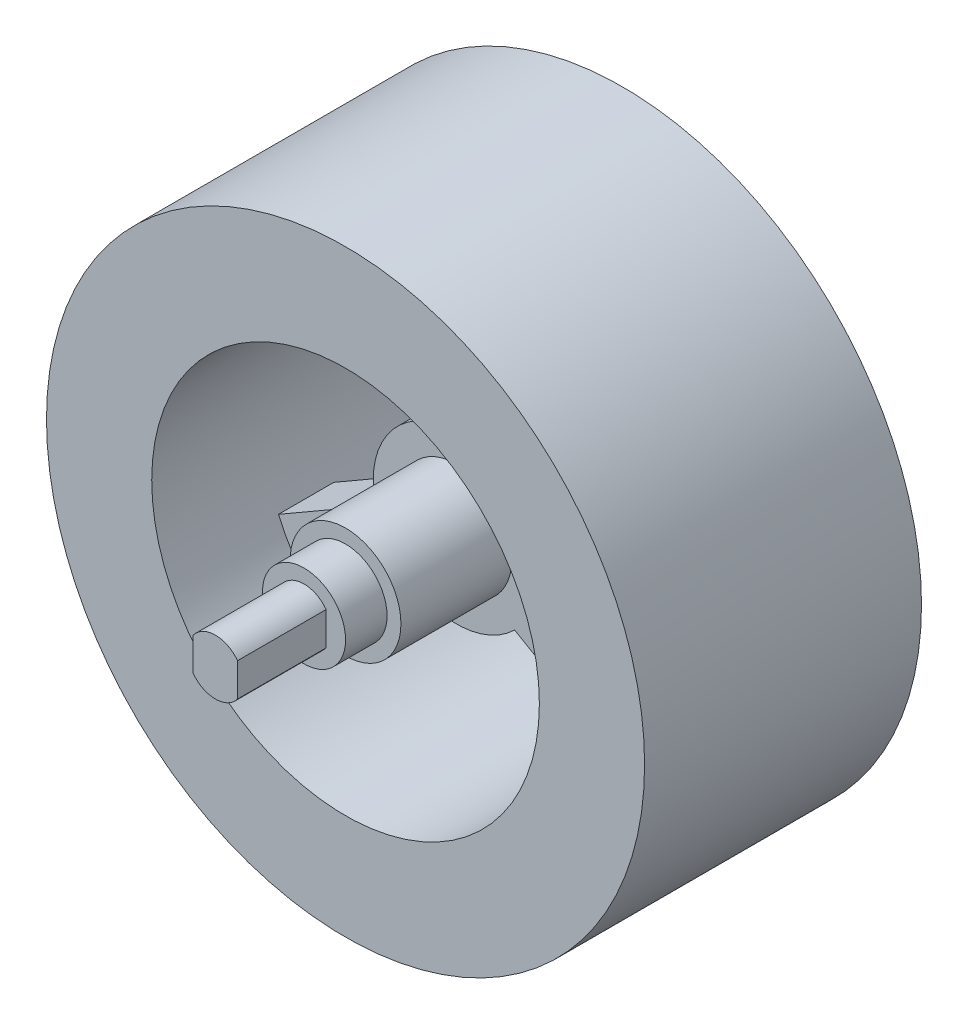
ISO-10303-21;
HEADER;
FILE_DESCRIPTION(('STEP AP214'),'2;1');
FILE_NAME('part.step','',(''),(''),'','','');
FILE_SCHEMA(('AUTOMOTIVE_DESIGN { 1 0 10303 214 1 1 1 1 }'));
ENDSEC;
DATA;
#1=APPLICATION_CONTEXT('core data for automotive mechanical design processes');
#2=APPLICATION_PROTOCOL_DEFINITION('international standard','automotive_design',2000,#1);
#3=PRODUCT_CONTEXT('',#1,'mechanical');
#4=PRODUCT('Part','Part','',(#3));
#5=PRODUCT_RELATED_PRODUCT_CATEGORY('part','',(#4));
#6=PRODUCT_DEFINITION_FORMATION('','',#4);
#7=PRODUCT_DEFINITION_CONTEXT('part definition',#1,'design');
#8=PRODUCT_DEFINITION('design','',#6,#7);
#9=PRODUCT_DEFINITION_SHAPE('','',#8);
#10=(LENGTH_UNIT() NAMED_UNIT(*) SI_UNIT(.MILLI.,.METRE.));
#11=(NAMED_UNIT(*) PLANE_ANGLE_UNIT() SI_UNIT($,.RADIAN.));
#12=(NAMED_UNIT(*) SI_UNIT($,.STERADIAN.) SOLID_ANGLE_UNIT());
#13=UNCERTAINTY_MEASURE_WITH_UNIT(LENGTH_MEASURE(1.E-05),#10,'distance_accuracy_value','');
#14=(GEOMETRIC_REPRESENTATION_CONTEXT(3) GLOBAL_UNCERTAINTY_ASSIGNED_CONTEXT((#13)) GLOBAL_UNIT_ASSIGNED_CONTEXT((#10,
#11,#12)) REPRESENTATION_CONTEXT('',''));
#15=CARTESIAN_POINT('',(0.,0.,0.));
#16=DIRECTION('',(0.,0.,1.));
#17=DIRECTION('',(1.,0.,0.));
#18=AXIS2_PLACEMENT_3D('',#15,#16,#17);
#19=CARTESIAN_POINT('',(0.,0.,48.5));
#20=DIRECTION('',(0.,0.,1.));
#21=DIRECTION('',(1.,0.,0.));
#22=AXIS2_PLACEMENT_3D('',#19,#20,#21);
#23=PLANE('',#22);
#24=CARTESIAN_POINT('',(0.,0.,48.5));
#25=DIRECTION('',(0.,0.,1.));
#26=DIRECTION('',(1.,0.,0.));
#27=AXIS2_PLACEMENT_3D('',#24,#25,#26);
#28=CIRCLE('',#27,5.);
#29=CARTESIAN_POINT('',(4.,3.,48.5));
#30=VERTEX_POINT('',#29);
#31=CARTESIAN_POINT('',(-4.,3.,48.5));
#32=VERTEX_POINT('',#31);
#33=EDGE_CURVE('E255',#30,#32,#28,.T.);
#34=ORIENTED_EDGE('',*,*,#33,.T.);
#35=DIRECTION('',(0.,-1.,0.));
#36=VECTOR('',#35,1.);
#37=CARTESIAN_POINT('',(-4.,3.,48.5));
#38=LINE('',#37,#36);
#39=CARTESIAN_POINT('',(-4.,-3.,48.5));
#40=VERTEX_POINT('',#39);
#41=EDGE_CURVE('E236',#32,#40,#38,.T.);
#42=ORIENTED_EDGE('',*,*,#41,.T.);
#43=CARTESIAN_POINT('',(4.,-3.,48.5));
#44=VERTEX_POINT('',#43);
#45=EDGE_CURVE('E260',#40,#44,#28,.T.);
#46=ORIENTED_EDGE('',*,*,#45,.T.);
#47=DIRECTION('',(0.,1.,0.));
#48=VECTOR('',#47,1.);
#49=CARTESIAN_POINT('',(4.,3.,48.5));
#50=LINE('',#49,#48);
#51=EDGE_CURVE('E360',#44,#30,#50,.T.);
#52=ORIENTED_EDGE('',*,*,#51,.T.);
#53=EDGE_LOOP('',(#34,#42,#46,#52));
#54=FACE_BOUND('',#53,.T.);
#55=ADVANCED_FACE('F89',(#54),#23,.T.);
#56=CARTESIAN_POINT('',(0.,0.,48.5));
#57=DIRECTION('',(0.,0.,-1.));
#58=DIRECTION('',(-1.,0.,0.));
#59=AXIS2_PLACEMENT_3D('',#56,#57,#58);
#60=CYLINDRICAL_SURFACE('',#59,5.);
#61=DIRECTION('',(0.,0.,1.));
#62=VECTOR('',#61,1.);
#63=CARTESIAN_POINT('',(-4.,-3.,32.5));
#64=LINE('',#63,#62);
#65=CARTESIAN_POINT('',(-4.,-3.,32.5));
#66=VERTEX_POINT('',#65);
#67=EDGE_CURVE('E242',#66,#40,#64,.T.);
#68=ORIENTED_EDGE('',*,*,#67,.F.);
#69=CARTESIAN_POINT('',(0.,0.,32.5));
#70=DIRECTION('',(0.,0.,1.));
#71=DIRECTION('',(1.,0.,0.));
#72=AXIS2_PLACEMENT_3D('',#69,#70,#71);
#73=CIRCLE('',#72,5.);
#74=CARTESIAN_POINT('',(4.,-3.,32.5));
#75=VERTEX_POINT('',#74);
#76=EDGE_CURVE('E248',#75,#66,#73,.F.);
#77=ORIENTED_EDGE('',*,*,#76,.F.);
#78=DIRECTION('',(0.,0.,1.));
#79=VECTOR('',#78,1.);
#80=CARTESIAN_POINT('',(4.,-3.,32.5));
#81=LINE('',#80,#79);
#82=EDGE_CURVE('E362',#75,#44,#81,.T.);
#83=ORIENTED_EDGE('',*,*,#82,.T.);
#84=ORIENTED_EDGE('',*,*,#45,.F.);
#85=EDGE_LOOP('',(#68,#77,#83,#84));
#86=FACE_BOUND('',#85,.T.);
#87=ADVANCED_FACE('F306',(#86),#60,.T.);
#88=DIRECTION('',(0.,0.,1.));
#89=VECTOR('',#88,1.);
#90=CARTESIAN_POINT('',(-4.,3.,32.5));
#91=LINE('',#90,#89);
#92=CARTESIAN_POINT('',(-4.,3.,32.5));
#93=VERTEX_POINT('',#92);
#94=EDGE_CURVE('E230',#93,#32,#91,.T.);
#95=ORIENTED_EDGE('',*,*,#94,.T.);
#96=ORIENTED_EDGE('',*,*,#33,.F.);
#97=DIRECTION('',(0.,0.,1.));
#98=VECTOR('',#97,1.);
#99=CARTESIAN_POINT('',(4.,3.,32.5));
#100=LINE('',#99,#98);
#101=CARTESIAN_POINT('',(4.,3.,32.5));
#102=VERTEX_POINT('',#101);
#103=EDGE_CURVE('E253',#102,#30,#100,.T.);
#104=ORIENTED_EDGE('',*,*,#103,.F.);
#105=EDGE_CURVE('E246',#93,#102,#73,.F.);
#106=ORIENTED_EDGE('',*,*,#105,.F.);
#107=EDGE_LOOP('',(#95,#96,#104,#106));
#108=FACE_BOUND('',#107,.T.);
#109=ADVANCED_FACE('F252',(#108),#60,.T.);
#110=CARTESIAN_POINT('',(0.,0.,-48.5));
#111=DIRECTION('',(0.,0.,1.));
#112=DIRECTION('',(1.,0.,0.));
#113=AXIS2_PLACEMENT_3D('',#110,#111,#112);
#114=CIRCLE('',#113,5.);
#115=CARTESIAN_POINT('',(4.,3.,-48.5));
#116=VERTEX_POINT('',#115);
#117=CARTESIAN_POINT('',(-4.,3.,-48.5));
#118=VERTEX_POINT('',#117);
#119=EDGE_CURVE('E342',#116,#118,#114,.T.);
#120=ORIENTED_EDGE('',*,*,#119,.T.);
#121=DIRECTION('',(0.,0.,-1.));
#122=VECTOR('',#121,1.);
#123=CARTESIAN_POINT('',(-4.,3.,-32.5));
#124=LINE('',#123,#122);
#125=CARTESIAN_POINT('',(-4.,3.,-32.5));
#126=VERTEX_POINT('',#125);
#127=EDGE_CURVE('E378',#126,#118,#124,.T.);
#128=ORIENTED_EDGE('',*,*,#127,.F.);
#129=CARTESIAN_POINT('',(0.,0.,-32.5));
#130=DIRECTION('',(0.,0.,1.));
#131=DIRECTION('',(1.,0.,0.));
#132=AXIS2_PLACEMENT_3D('',#129,#130,#131);
#133=CIRCLE('',#132,5.);
#134=CARTESIAN_POINT('',(4.,3.,-32.5));
#135=VERTEX_POINT('',#134);
#136=EDGE_CURVE('E269',#126,#135,#133,.F.);
#137=ORIENTED_EDGE('',*,*,#136,.T.);
#138=DIRECTION('',(0.,0.,-1.));
#139=VECTOR('',#138,1.);
#140=CARTESIAN_POINT('',(4.,3.,-32.5));
#141=LINE('',#140,#139);
#142=EDGE_CURVE('E388',#135,#116,#141,.T.);
#143=ORIENTED_EDGE('',*,*,#142,.T.);
#144=EDGE_LOOP('',(#120,#128,#137,#143));
#145=FACE_BOUND('',#144,.T.);
#146=ADVANCED_FACE('F699',(#145),#60,.T.);
#147=CARTESIAN_POINT('',(4.,-3.,-32.5));
#148=VERTEX_POINT('',#147);
#149=CARTESIAN_POINT('',(-4.,-3.,-32.5));
#150=VERTEX_POINT('',#149);
#151=EDGE_CURVE('E276',#148,#150,#133,.F.);
#152=ORIENTED_EDGE('',*,*,#151,.T.);
#153=DIRECTION('',(0.,0.,-1.));
#154=VECTOR('',#153,1.);
#155=CARTESIAN_POINT('',(-4.,-3.,-32.5));
#156=LINE('',#155,#154);
#157=CARTESIAN_POINT('',(-4.,-3.,-48.5));
#158=VERTEX_POINT('',#157);
#159=EDGE_CURVE('E374',#150,#158,#156,.T.);
#160=ORIENTED_EDGE('',*,*,#159,.T.);
#161=CARTESIAN_POINT('',(4.,-3.,-48.5));
#162=VERTEX_POINT('',#161);
#163=EDGE_CURVE('E264',#158,#162,#114,.T.);
#164=ORIENTED_EDGE('',*,*,#163,.T.);
#165=DIRECTION('',(0.,0.,-1.));
#166=VECTOR('',#165,1.);
#167=CARTESIAN_POINT('',(4.,-3.,-32.5));
#168=LINE('',#167,#166);
#169=EDGE_CURVE('E377',#148,#162,#168,.T.);
#170=ORIENTED_EDGE('',*,*,#169,.F.);
#171=EDGE_LOOP('',(#152,#160,#164,#170));
#172=FACE_BOUND('',#171,.T.);
#173=ADVANCED_FACE('F314',(#172),#60,.T.);
#174=CARTESIAN_POINT('',(0.,0.,-5.));
#175=DIRECTION('',(0.,0.,1.));
#176=DIRECTION('',(1.,0.,0.));
#177=AXIS2_PLACEMENT_3D('',#174,#175,#176);
#178=PLANE('',#177);
#179=CARTESIAN_POINT('',(0.,0.,-5.));
#180=DIRECTION('',(0.,0.,1.));
#181=DIRECTION('',(1.,0.,0.));
#182=AXIS2_PLACEMENT_3D('',#179,#180,#181);
#183=CIRCLE('',#182,10.);
#184=CARTESIAN_POINT('',(10.,0.,-5.));
#185=VERTEX_POINT('',#184);
#186=EDGE_CURVE('E12',#185,#185,#183,.F.);
#187=ORIENTED_EDGE('',*,*,#186,.F.);
#188=EDGE_LOOP('',(#187));
#189=FACE_BOUND('',#188,.T.);
#190=DIRECTION('',(0.866025403784439,-0.5,0.));
#191=VECTOR('',#190,1.);
#192=CARTESIAN_POINT('',(2.,3.46410161513775,-5.));
#193=LINE('',#192,#191);
#194=CARTESIAN_POINT('',(14.5199840255489,-3.76431453226272,-5.));
#195=VERTEX_POINT('',#194);
#196=CARTESIAN_POINT('',(32.1122898498271,-13.921237035576,-5.));
#197=VERTEX_POINT('',#196);
#198=EDGE_CURVE('E498',#195,#197,#193,.T.);
#199=ORIENTED_EDGE('',*,*,#198,.T.);
#200=CARTESIAN_POINT('',(0.,0.,-5.));
#201=DIRECTION('',(0.,0.,1.));
#202=DIRECTION('',(1.,0.,0.));
#203=AXIS2_PLACEMENT_3D('',#200,#201,#202);
#204=CIRCLE('',#203,35.);
#205=CARTESIAN_POINT('',(28.1122898498271,-20.8494402658515,-5.));
#206=VERTEX_POINT('',#205);
#207=EDGE_CURVE('E421',#197,#206,#204,.F.);
#208=ORIENTED_EDGE('',*,*,#207,.T.);
#209=DIRECTION('',(0.866025403784439,-0.5,0.));
#210=VECTOR('',#209,1.);
#211=CARTESIAN_POINT('',(-2.,-3.46410161513776,-5.));
#212=LINE('',#211,#210);
#213=CARTESIAN_POINT('',(10.5199840255489,-10.6925177625382,-5.));
#214=VERTEX_POINT('',#213);
#215=EDGE_CURVE('E494',#214,#206,#212,.T.);
#216=ORIENTED_EDGE('',*,*,#215,.F.);
#217=CARTESIAN_POINT('',(0.,0.,-5.));
#218=DIRECTION('',(0.,0.,1.));
#219=DIRECTION('',(1.,0.,0.));
#220=AXIS2_PLACEMENT_3D('',#217,#218,#219);
#221=CIRCLE('',#220,15.);
#222=CARTESIAN_POINT('',(-10.5199840255489,-10.6925177625382,-5.));
#223=VERTEX_POINT('',#222);
#224=EDGE_CURVE('E486',#223,#214,#221,.T.);
#225=ORIENTED_EDGE('',*,*,#224,.F.);
#226=DIRECTION('',(-0.866025403784438,-0.500000000000001,0.));
#227=VECTOR('',#226,1.);
#228=CARTESIAN_POINT('',(2.,-3.46410161513775,-5.));
#229=LINE('',#228,#227);
#230=CARTESIAN_POINT('',(-28.1122898498271,-20.8494402658515,-5.));
#231=VERTEX_POINT('',#230);
#232=EDGE_CURVE('E490',#223,#231,#229,.T.);
#233=ORIENTED_EDGE('',*,*,#232,.T.);
#234=CARTESIAN_POINT('',(-32.1122898498271,-13.921237035576,-5.));
#235=VERTEX_POINT('',#234);
#236=EDGE_CURVE('E429',#231,#235,#204,.F.);
#237=ORIENTED_EDGE('',*,*,#236,.T.);
#238=DIRECTION('',(-0.866025403784438,-0.5,0.));
#239=VECTOR('',#238,1.);
#240=CARTESIAN_POINT('',(-2.,3.46410161513776,-5.));
#241=LINE('',#240,#239);
#242=CARTESIAN_POINT('',(-14.5199840255489,-3.76431453226273,-5.));
#243=VERTEX_POINT('',#242);
#244=EDGE_CURVE('E484',#243,#235,#241,.T.);
#245=ORIENTED_EDGE('',*,*,#244,.F.);
#246=CARTESIAN_POINT('',(-4.,14.456832294801,-5.));
#247=VERTEX_POINT('',#246);
#248=EDGE_CURVE('E481',#247,#243,#221,.T.);
#249=ORIENTED_EDGE('',*,*,#248,.F.);
#250=DIRECTION('',(0.,1.,0.));
#251=VECTOR('',#250,1.);
#252=CARTESIAN_POINT('',(-4.,0.,-5.));
#253=LINE('',#252,#251);
#254=CARTESIAN_POINT('',(-4.,34.7706773014274,-5.));
#255=VERTEX_POINT('',#254);
#256=EDGE_CURVE('E427',#247,#255,#253,.T.);
#257=ORIENTED_EDGE('',*,*,#256,.T.);
#258=CARTESIAN_POINT('',(4.,34.7706773014274,-5.));
#259=VERTEX_POINT('',#258);
#260=EDGE_CURVE('E424',#255,#259,#204,.F.);
#261=ORIENTED_EDGE('',*,*,#260,.T.);
#262=DIRECTION('',(0.,1.,0.));
#263=VECTOR('',#262,1.);
#264=CARTESIAN_POINT('',(4.,0.,-5.));
#265=LINE('',#264,#263);
#266=CARTESIAN_POINT('',(4.,14.456832294801,-5.));
#267=VERTEX_POINT('',#266);
#268=EDGE_CURVE('E454',#267,#259,#265,.T.);
#269=ORIENTED_EDGE('',*,*,#268,.F.);
#270=EDGE_CURVE('E485',#195,#267,#221,.T.);
#271=ORIENTED_EDGE('',*,*,#270,.F.);
#272=EDGE_LOOP('',(#199,#208,#216,#225,#233,#237,#245,#249,#257,#261,#269,#271));
#273=FACE_BOUND('',#272,.T.);
#274=ADVANCED_FACE('F524',(#189,#273),#178,.F.);
#275=CARTESIAN_POINT('',(0.,0.,5.));
#276=DIRECTION('',(0.,0.,1.));
#277=DIRECTION('',(1.,0.,0.));
#278=AXIS2_PLACEMENT_3D('',#275,#276,#277);
#279=PLANE('',#278);
#280=CARTESIAN_POINT('',(0.,0.,5.));
#281=DIRECTION('',(0.,0.,1.));
#282=DIRECTION('',(1.,0.,0.));
#283=AXIS2_PLACEMENT_3D('',#280,#281,#282);
#284=CIRCLE('',#283,10.);
#285=CARTESIAN_POINT('',(10.,0.,5.));
#286=VERTEX_POINT('',#285);
#287=EDGE_CURVE('E93',#286,#286,#284,.F.);
#288=ORIENTED_EDGE('',*,*,#287,.T.);
#289=EDGE_LOOP('',(#288));
#290=FACE_BOUND('',#289,.T.);
#291=CARTESIAN_POINT('',(0.,0.,5.));
#292=DIRECTION('',(0.,0.,1.));
#293=DIRECTION('',(1.,0.,0.));
#294=AXIS2_PLACEMENT_3D('',#291,#292,#293);
#295=CIRCLE('',#294,35.);
#296=CARTESIAN_POINT('',(32.1122898498271,-13.921237035576,5.));
#297=VERTEX_POINT('',#296);
#298=CARTESIAN_POINT('',(28.1122898498271,-20.8494402658515,5.));
#299=VERTEX_POINT('',#298);
#300=EDGE_CURVE('E415',#297,#299,#295,.F.);
#301=ORIENTED_EDGE('',*,*,#300,.F.);
#302=DIRECTION('',(0.866025403784439,-0.5,0.));
#303=VECTOR('',#302,1.);
#304=CARTESIAN_POINT('',(2.,3.46410161513775,5.));
#305=LINE('',#304,#303);
#306=CARTESIAN_POINT('',(14.5199840255489,-3.76431453226272,5.));
#307=VERTEX_POINT('',#306);
#308=EDGE_CURVE('E470',#307,#297,#305,.T.);
#309=ORIENTED_EDGE('',*,*,#308,.F.);
#310=CARTESIAN_POINT('',(0.,0.,5.));
#311=DIRECTION('',(0.,0.,1.));
#312=DIRECTION('',(1.,0.,0.));
#313=AXIS2_PLACEMENT_3D('',#310,#311,#312);
#314=CIRCLE('',#313,15.);
#315=CARTESIAN_POINT('',(4.,14.456832294801,5.));
#316=VERTEX_POINT('',#315);
#317=EDGE_CURVE('E458',#307,#316,#314,.T.);
#318=ORIENTED_EDGE('',*,*,#317,.T.);
#319=DIRECTION('',(0.,1.,0.));
#320=VECTOR('',#319,1.);
#321=CARTESIAN_POINT('',(4.,0.,5.));
#322=LINE('',#321,#320);
#323=CARTESIAN_POINT('',(4.,34.7706773014274,5.));
#324=VERTEX_POINT('',#323);
#325=EDGE_CURVE('E473',#316,#324,#322,.T.);
#326=ORIENTED_EDGE('',*,*,#325,.T.);
#327=CARTESIAN_POINT('',(-4.,34.7706773014274,5.));
#328=VERTEX_POINT('',#327);
#329=EDGE_CURVE('E422',#328,#324,#295,.F.);
#330=ORIENTED_EDGE('',*,*,#329,.F.);
#331=DIRECTION('',(0.,1.,0.));
#332=VECTOR('',#331,1.);
#333=CARTESIAN_POINT('',(-4.,0.,5.));
#334=LINE('',#333,#332);
#335=CARTESIAN_POINT('',(-4.,14.456832294801,5.));
#336=VERTEX_POINT('',#335);
#337=EDGE_CURVE('E449',#336,#328,#334,.T.);
#338=ORIENTED_EDGE('',*,*,#337,.F.);
#339=CARTESIAN_POINT('',(-14.5199840255489,-3.76431453226273,5.));
#340=VERTEX_POINT('',#339);
#341=EDGE_CURVE('E453',#336,#340,#314,.T.);
#342=ORIENTED_EDGE('',*,*,#341,.T.);
#343=DIRECTION('',(-0.866025403784438,-0.5,0.));
#344=VECTOR('',#343,1.);
#345=CARTESIAN_POINT('',(-2.,3.46410161513776,5.));
#346=LINE('',#345,#344);
#347=CARTESIAN_POINT('',(-32.1122898498271,-13.921237035576,5.));
#348=VERTEX_POINT('',#347);
#349=EDGE_CURVE('E457',#340,#348,#346,.T.);
#350=ORIENTED_EDGE('',*,*,#349,.T.);
#351=CARTESIAN_POINT('',(-28.1122898498271,-20.8494402658515,5.));
#352=VERTEX_POINT('',#351);
#353=EDGE_CURVE('E423',#352,#348,#295,.F.);
#354=ORIENTED_EDGE('',*,*,#353,.F.);
#355=DIRECTION('',(-0.866025403784438,-0.500000000000001,0.));
#356=VECTOR('',#355,1.);
#357=CARTESIAN_POINT('',(2.,-3.46410161513775,5.));
#358=LINE('',#357,#356);
#359=CARTESIAN_POINT('',(-10.5199840255489,-10.6925177625382,5.));
#360=VERTEX_POINT('',#359);
#361=EDGE_CURVE('E463',#360,#352,#358,.T.);
#362=ORIENTED_EDGE('',*,*,#361,.F.);
#363=CARTESIAN_POINT('',(10.5199840255489,-10.6925177625382,5.));
#364=VERTEX_POINT('',#363);
#365=EDGE_CURVE('E459',#360,#364,#314,.T.);
#366=ORIENTED_EDGE('',*,*,#365,.T.);
#367=DIRECTION('',(0.866025403784439,-0.5,0.));
#368=VECTOR('',#367,1.);
#369=CARTESIAN_POINT('',(-2.,-3.46410161513776,5.));
#370=LINE('',#369,#368);
#371=EDGE_CURVE('E466',#364,#299,#370,.T.);
#372=ORIENTED_EDGE('',*,*,#371,.T.);
#373=EDGE_LOOP('',(#301,#309,#318,#326,#330,#338,#342,#350,#354,#362,#366,#372));
#374=FACE_BOUND('',#373,.T.);
#375=ADVANCED_FACE('F548',(#290,#374),#279,.T.);
#376=CARTESIAN_POINT('',(4.,0.,5.));
#377=DIRECTION('',(-1.,0.,0.));
#378=DIRECTION('',(0.,0.,1.));
#379=AXIS2_PLACEMENT_3D('',#376,#377,#378);
#380=PLANE('',#379);
#381=ORIENTED_EDGE('',*,*,#268,.T.);
#382=DIRECTION('',(0.,0.,-1.));
#383=VECTOR('',#382,1.);
#384=CARTESIAN_POINT('',(4.,34.7706773014274,25.));
#385=LINE('',#384,#383);
#386=EDGE_CURVE('E428',#259,#324,#385,.F.);
#387=ORIENTED_EDGE('',*,*,#386,.T.);
#388=ORIENTED_EDGE('',*,*,#325,.F.);
#389=DIRECTION('',(0.,0.,-1.));
#390=VECTOR('',#389,1.);
#391=CARTESIAN_POINT('',(4.,14.456832294801,5.));
#392=LINE('',#391,#390);
#393=EDGE_CURVE('E477',#316,#267,#392,.T.);
#394=ORIENTED_EDGE('',*,*,#393,.T.);
#395=EDGE_LOOP('',(#381,#387,#388,#394));
#396=FACE_BOUND('',#395,.T.);
#397=ADVANCED_FACE('F556',(#396),#380,.F.);
#398=CARTESIAN_POINT('',(-4.,0.,5.));
#399=DIRECTION('',(-1.,0.,0.));
#400=DIRECTION('',(0.,0.,1.));
#401=AXIS2_PLACEMENT_3D('',#398,#399,#400);
#402=PLANE('',#401);
#403=DIRECTION('',(0.,0.,-1.));
#404=VECTOR('',#403,1.);
#405=CARTESIAN_POINT('',(-4.,34.7706773014274,25.));
#406=LINE('',#405,#404);
#407=EDGE_CURVE('E442',#255,#328,#406,.F.);
#408=ORIENTED_EDGE('',*,*,#407,.F.);
#409=ORIENTED_EDGE('',*,*,#256,.F.);
#410=DIRECTION('',(0.,0.,-1.));
#411=VECTOR('',#410,1.);
#412=CARTESIAN_POINT('',(-4.,14.456832294801,5.));
#413=LINE('',#412,#411);
#414=EDGE_CURVE('E343',#336,#247,#413,.T.);
#415=ORIENTED_EDGE('',*,*,#414,.F.);
#416=ORIENTED_EDGE('',*,*,#337,.T.);
#417=EDGE_LOOP('',(#408,#409,#415,#416));
#418=FACE_BOUND('',#417,.T.);
#419=ADVANCED_FACE('F317',(#418),#402,.T.);
#420=CARTESIAN_POINT('',(0.,0.,5.));
#421=DIRECTION('',(0.,0.,-1.));
#422=DIRECTION('',(-1.,0.,0.));
#423=AXIS2_PLACEMENT_3D('',#420,#421,#422);
#424=CYLINDRICAL_SURFACE('',#423,15.);
#425=ORIENTED_EDGE('',*,*,#248,.T.);
#426=DIRECTION('',(0.,0.,-1.));
#427=VECTOR('',#426,1.);
#428=CARTESIAN_POINT('',(-14.5199840255489,-3.76431453226273,5.));
#429=LINE('',#428,#427);
#430=EDGE_CURVE('E346',#340,#243,#429,.T.);
#431=ORIENTED_EDGE('',*,*,#430,.F.);
#432=ORIENTED_EDGE('',*,*,#341,.F.);
#433=ORIENTED_EDGE('',*,*,#414,.T.);
#434=EDGE_LOOP('',(#425,#431,#432,#433));
#435=FACE_BOUND('',#434,.T.);
#436=ADVANCED_FACE('F570',(#435),#424,.T.);
#437=CARTESIAN_POINT('',(-2.,3.46410161513776,5.));
#438=DIRECTION('',(0.5,-0.866025403784438,0.));
#439=DIRECTION('',(0.866025403784438,0.5,0.));
#440=AXIS2_PLACEMENT_3D('',#437,#438,#439);
#441=PLANE('',#440);
#442=ORIENTED_EDGE('',*,*,#244,.T.);
#443=DIRECTION('',(0.,0.,-1.));
#444=VECTOR('',#443,1.);
#445=CARTESIAN_POINT('',(-32.1122898498271,-13.921237035576,25.));
#446=LINE('',#445,#444);
#447=EDGE_CURVE('E438',#235,#348,#446,.F.);
#448=ORIENTED_EDGE('',*,*,#447,.T.);
#449=ORIENTED_EDGE('',*,*,#349,.F.);
#450=ORIENTED_EDGE('',*,*,#430,.T.);
#451=EDGE_LOOP('',(#442,#448,#449,#450));
#452=FACE_BOUND('',#451,.T.);
#453=ADVANCED_FACE('F572',(#452),#441,.F.);
#454=CARTESIAN_POINT('',(2.,-3.46410161513775,5.));
#455=DIRECTION('',(0.500000000000001,-0.866025403784438,0.));
#456=DIRECTION('',(0.866025403784438,0.500000000000001,0.));
#457=AXIS2_PLACEMENT_3D('',#454,#455,#456);
#458=PLANE('',#457);
#459=DIRECTION('',(0.,0.,-1.));
#460=VECTOR('',#459,1.);
#461=CARTESIAN_POINT('',(-28.1122898498271,-20.8494402658515,25.));
#462=LINE('',#461,#460);
#463=EDGE_CURVE('E434',#231,#352,#462,.F.);
#464=ORIENTED_EDGE('',*,*,#463,.F.);
#465=ORIENTED_EDGE('',*,*,#232,.F.);
#466=DIRECTION('',(0.,0.,-1.));
#467=VECTOR('',#466,1.);
#468=CARTESIAN_POINT('',(-10.5199840255489,-10.6925177625382,5.));
#469=LINE('',#468,#467);
#470=EDGE_CURVE('E353',#360,#223,#469,.T.);
#471=ORIENTED_EDGE('',*,*,#470,.F.);
#472=ORIENTED_EDGE('',*,*,#361,.T.);
#473=EDGE_LOOP('',(#464,#465,#471,#472));
#474=FACE_BOUND('',#473,.T.);
#475=ADVANCED_FACE('F527',(#474),#458,.T.);
#476=ORIENTED_EDGE('',*,*,#224,.T.);
#477=DIRECTION('',(0.,0.,-1.));
#478=VECTOR('',#477,1.);
#479=CARTESIAN_POINT('',(10.5199840255489,-10.6925177625382,5.));
#480=LINE('',#479,#478);
#481=EDGE_CURVE('E510',#364,#214,#480,.T.);
#482=ORIENTED_EDGE('',*,*,#481,.F.);
#483=ORIENTED_EDGE('',*,*,#365,.F.);
#484=ORIENTED_EDGE('',*,*,#470,.T.);
#485=EDGE_LOOP('',(#476,#482,#483,#484));
#486=FACE_BOUND('',#485,.T.);
#487=ADVANCED_FACE('F517',(#486),#424,.T.);
#488=CARTESIAN_POINT('',(-2.,-3.46410161513776,5.));
#489=DIRECTION('',(0.5,0.866025403784439,0.));
#490=DIRECTION('',(-0.866025403784439,0.5,0.));
#491=AXIS2_PLACEMENT_3D('',#488,#489,#490);
#492=PLANE('',#491);
#493=ORIENTED_EDGE('',*,*,#215,.T.);
#494=DIRECTION('',(0.,0.,-1.));
#495=VECTOR('',#494,1.);
#496=CARTESIAN_POINT('',(28.1122898498271,-20.8494402658515,25.));
#497=LINE('',#496,#495);
#498=EDGE_CURVE('E430',#206,#299,#497,.F.);
#499=ORIENTED_EDGE('',*,*,#498,.T.);
#500=ORIENTED_EDGE('',*,*,#371,.F.);
#501=ORIENTED_EDGE('',*,*,#481,.T.);
#502=EDGE_LOOP('',(#493,#499,#500,#501));
#503=FACE_BOUND('',#502,.T.);
#504=ADVANCED_FACE('F542',(#503),#492,.F.);
#505=CARTESIAN_POINT('',(2.,3.46410161513775,5.));
#506=DIRECTION('',(0.5,0.866025403784439,0.));
#507=DIRECTION('',(-0.866025403784439,0.5,0.));
#508=AXIS2_PLACEMENT_3D('',#505,#506,#507);
#509=PLANE('',#508);
#510=DIRECTION('',(0.,0.,-1.));
#511=VECTOR('',#510,1.);
#512=CARTESIAN_POINT('',(32.1122898498271,-13.921237035576,25.));
#513=LINE('',#512,#511);
#514=EDGE_CURVE('E277',#197,#297,#513,.F.);
#515=ORIENTED_EDGE('',*,*,#514,.F.);
#516=ORIENTED_EDGE('',*,*,#198,.F.);
#517=DIRECTION('',(0.,0.,-1.));
#518=VECTOR('',#517,1.);
#519=CARTESIAN_POINT('',(14.5199840255489,-3.76431453226272,5.));
#520=LINE('',#519,#518);
#521=EDGE_CURVE('E507',#307,#195,#520,.T.);
#522=ORIENTED_EDGE('',*,*,#521,.F.);
#523=ORIENTED_EDGE('',*,*,#308,.T.);
#524=EDGE_LOOP('',(#515,#516,#522,#523));
#525=FACE_BOUND('',#524,.T.);
#526=ADVANCED_FACE('F583',(#525),#509,.T.);
#527=ORIENTED_EDGE('',*,*,#270,.T.);
#528=ORIENTED_EDGE('',*,*,#393,.F.);
#529=ORIENTED_EDGE('',*,*,#317,.F.);
#530=ORIENTED_EDGE('',*,*,#521,.T.);
#531=EDGE_LOOP('',(#527,#528,#529,#530));
#532=FACE_BOUND('',#531,.T.);
#533=ADVANCED_FACE('F565',(#532),#424,.T.);
#534=CARTESIAN_POINT('',(0.,0.,25.));
#535=DIRECTION('',(0.,0.,-1.));
#536=DIRECTION('',(-1.,0.,0.));
#537=AXIS2_PLACEMENT_3D('',#534,#535,#536);
#538=CYLINDRICAL_SURFACE('',#537,35.);
#539=ORIENTED_EDGE('',*,*,#447,.F.);
#540=ORIENTED_EDGE('',*,*,#236,.F.);
#541=ORIENTED_EDGE('',*,*,#463,.T.);
#542=ORIENTED_EDGE('',*,*,#353,.T.);
#543=EDGE_LOOP('',(#539,#540,#541,#542));
#544=FACE_BOUND('',#543,.T.);
#545=ORIENTED_EDGE('',*,*,#498,.F.);
#546=ORIENTED_EDGE('',*,*,#207,.F.);
#547=ORIENTED_EDGE('',*,*,#514,.T.);
#548=ORIENTED_EDGE('',*,*,#300,.T.);
#549=EDGE_LOOP('',(#545,#546,#547,#548));
#550=FACE_BOUND('',#549,.T.);
#551=CARTESIAN_POINT('',(0.,0.,-25.));
#552=DIRECTION('',(0.,0.,1.));
#553=DIRECTION('',(1.,0.,0.));
#554=AXIS2_PLACEMENT_3D('',#551,#552,#553);
#555=CIRCLE('',#554,35.);
#556=CARTESIAN_POINT('',(35.,0.,-25.));
#557=VERTEX_POINT('',#556);
#558=EDGE_CURVE('E407',#557,#557,#555,.T.);
#559=ORIENTED_EDGE('',*,*,#558,.F.);
#560=EDGE_LOOP('',(#559));
#561=FACE_BOUND('',#560,.T.);
#562=CARTESIAN_POINT('',(0.,0.,25.));
#563=DIRECTION('',(0.,0.,1.));
#564=DIRECTION('',(1.,0.,0.));
#565=AXIS2_PLACEMENT_3D('',#562,#563,#564);
#566=CIRCLE('',#565,35.);
#567=CARTESIAN_POINT('',(35.,0.,25.));
#568=VERTEX_POINT('',#567);
#569=EDGE_CURVE('E402',#568,#568,#566,.T.);
#570=ORIENTED_EDGE('',*,*,#569,.T.);
#571=EDGE_LOOP('',(#570));
#572=FACE_BOUND('',#571,.T.);
#573=ORIENTED_EDGE('',*,*,#260,.F.);
#574=ORIENTED_EDGE('',*,*,#407,.T.);
#575=ORIENTED_EDGE('',*,*,#329,.T.);
#576=ORIENTED_EDGE('',*,*,#386,.F.);
#577=EDGE_LOOP('',(#573,#574,#575,#576));
#578=FACE_BOUND('',#577,.T.);
#579=ADVANCED_FACE('F531',(#544,#550,#561,#572,#578),#538,.F.);
#580=CARTESIAN_POINT('',(0.,0.,25.));
#581=DIRECTION('',(0.,0.,1.));
#582=DIRECTION('',(1.,0.,0.));
#583=AXIS2_PLACEMENT_3D('',#580,#581,#582);
#584=PLANE('',#583);
#585=CARTESIAN_POINT('',(0.,0.,25.));
#586=DIRECTION('',(0.,0.,1.));
#587=DIRECTION('',(1.,0.,0.));
#588=AXIS2_PLACEMENT_3D('',#585,#586,#587);
#589=CIRCLE('',#588,54.);
#590=CARTESIAN_POINT('',(54.,0.,25.));
#591=VERTEX_POINT('',#590);
#592=EDGE_CURVE('E411',#591,#591,#589,.T.);
#593=ORIENTED_EDGE('',*,*,#592,.T.);
#594=EDGE_LOOP('',(#593));
#595=FACE_BOUND('',#594,.T.);
#596=ORIENTED_EDGE('',*,*,#569,.F.);
#597=EDGE_LOOP('',(#596));
#598=FACE_BOUND('',#597,.T.);
#599=ADVANCED_FACE('F604',(#595,#598),#584,.T.);
#600=CARTESIAN_POINT('',(0.,0.,-25.));
#601=DIRECTION('',(0.,0.,1.));
#602=DIRECTION('',(1.,0.,0.));
#603=AXIS2_PLACEMENT_3D('',#600,#601,#602);
#604=PLANE('',#603);
#605=CARTESIAN_POINT('',(0.,0.,-25.));
#606=DIRECTION('',(0.,0.,1.));
#607=DIRECTION('',(1.,0.,0.));
#608=AXIS2_PLACEMENT_3D('',#605,#606,#607);
#609=CIRCLE('',#608,54.);
#610=CARTESIAN_POINT('',(54.,0.,-25.));
#611=VERTEX_POINT('',#610);
#612=EDGE_CURVE('E406',#611,#611,#609,.T.);
#613=ORIENTED_EDGE('',*,*,#612,.F.);
#614=EDGE_LOOP('',(#613));
#615=FACE_BOUND('',#614,.T.);
#616=ORIENTED_EDGE('',*,*,#558,.T.);
#617=EDGE_LOOP('',(#616));
#618=FACE_BOUND('',#617,.T.);
#619=ADVANCED_FACE('F600',(#615,#618),#604,.F.);
#620=CARTESIAN_POINT('',(0.,0.,25.));
#621=DIRECTION('',(0.,0.,-1.));
#622=DIRECTION('',(-1.,0.,0.));
#623=AXIS2_PLACEMENT_3D('',#620,#621,#622);
#624=CYLINDRICAL_SURFACE('',#623,54.);
#625=ORIENTED_EDGE('',*,*,#592,.F.);
#626=EDGE_LOOP('',(#625));
#627=FACE_BOUND('',#626,.T.);
#628=ORIENTED_EDGE('',*,*,#612,.T.);
#629=EDGE_LOOP('',(#628));
#630=FACE_BOUND('',#629,.T.);
#631=ADVANCED_FACE('F596',(#627,#630),#624,.T.);
#632=CARTESIAN_POINT('',(0.,0.,25.));
#633=DIRECTION('',(0.,0.,1.));
#634=DIRECTION('',(1.,0.,0.));
#635=AXIS2_PLACEMENT_3D('',#632,#633,#634);
#636=PLANE('',#635);
#637=CARTESIAN_POINT('',(0.,0.,25.));
#638=DIRECTION('',(0.,0.,1.));
#639=DIRECTION('',(1.,0.,0.));
#640=AXIS2_PLACEMENT_3D('',#637,#638,#639);
#641=CIRCLE('',#640,7.5);
#642=CARTESIAN_POINT('',(7.5,0.,25.));
#643=VERTEX_POINT('',#642);
#644=EDGE_CURVE('E281',#643,#643,#641,.T.);
#645=ORIENTED_EDGE('',*,*,#644,.F.);
#646=EDGE_LOOP('',(#645));
#647=FACE_BOUND('',#646,.T.);
#648=CARTESIAN_POINT('',(0.,0.,25.));
#649=DIRECTION('',(0.,0.,1.));
#650=DIRECTION('',(1.,0.,0.));
#651=AXIS2_PLACEMENT_3D('',#648,#649,#650);
#652=CIRCLE('',#651,10.);
#653=CARTESIAN_POINT('',(10.,0.,25.));
#654=VERTEX_POINT('',#653);
#655=EDGE_CURVE('E284',#654,#654,#652,.T.);
#656=ORIENTED_EDGE('',*,*,#655,.T.);
#657=EDGE_LOOP('',(#656));
#658=FACE_BOUND('',#657,.T.);
#659=ADVANCED_FACE('F599',(#647,#658),#636,.T.);
#660=CARTESIAN_POINT('',(0.,0.,25.));
#661=DIRECTION('',(0.,0.,-1.));
#662=DIRECTION('',(-1.,0.,0.));
#663=AXIS2_PLACEMENT_3D('',#660,#661,#662);
#664=CYLINDRICAL_SURFACE('',#663,10.);
#665=ORIENTED_EDGE('',*,*,#287,.F.);
#666=EDGE_LOOP('',(#665));
#667=FACE_BOUND('',#666,.T.);
#668=ORIENTED_EDGE('',*,*,#655,.F.);
#669=EDGE_LOOP('',(#668));
#670=FACE_BOUND('',#669,.T.);
#671=ADVANCED_FACE('F611',(#667,#670),#664,.T.);
#672=CARTESIAN_POINT('',(0.,0.,-25.));
#673=DIRECTION('',(0.,0.,1.));
#674=DIRECTION('',(1.,0.,0.));
#675=AXIS2_PLACEMENT_3D('',#672,#673,#674);
#676=CIRCLE('',#675,10.);
#677=CARTESIAN_POINT('',(10.,0.,-25.));
#678=VERTEX_POINT('',#677);
#679=EDGE_CURVE('E381',#678,#678,#676,.T.);
#680=ORIENTED_EDGE('',*,*,#679,.T.);
#681=EDGE_LOOP('',(#680));
#682=FACE_BOUND('',#681,.T.);
#683=ORIENTED_EDGE('',*,*,#186,.T.);
#684=EDGE_LOOP('',(#683));
#685=FACE_BOUND('',#684,.T.);
#686=ADVANCED_FACE('F324',(#682,#685),#664,.T.);
#687=CARTESIAN_POINT('',(0.,0.,-25.));
#688=DIRECTION('',(0.,0.,1.));
#689=DIRECTION('',(1.,0.,0.));
#690=AXIS2_PLACEMENT_3D('',#687,#688,#689);
#691=PLANE('',#690);
#692=CARTESIAN_POINT('',(0.,0.,-25.));
#693=DIRECTION('',(0.,0.,1.));
#694=DIRECTION('',(1.,0.,0.));
#695=AXIS2_PLACEMENT_3D('',#692,#693,#694);
#696=CIRCLE('',#695,7.5);
#697=CARTESIAN_POINT('',(7.5,0.,-25.));
#698=VERTEX_POINT('',#697);
#699=EDGE_CURVE('E99',#698,#698,#696,.T.);
#700=ORIENTED_EDGE('',*,*,#699,.T.);
#701=EDGE_LOOP('',(#700));
#702=FACE_BOUND('',#701,.T.);
#703=ORIENTED_EDGE('',*,*,#679,.F.);
#704=EDGE_LOOP('',(#703));
#705=FACE_BOUND('',#704,.T.);
#706=ADVANCED_FACE('F289',(#702,#705),#691,.F.);
#707=CARTESIAN_POINT('',(0.,0.,-48.5));
#708=DIRECTION('',(0.,0.,1.));
#709=DIRECTION('',(1.,0.,0.));
#710=AXIS2_PLACEMENT_3D('',#707,#708,#709);
#711=PLANE('',#710);
#712=CARTESIAN_POINT('',(0.,0.,-48.5));
#713=DIRECTION('',(0.,0.,-1.));
#714=DIRECTION('',(-1.,0.,0.));
#715=AXIS2_PLACEMENT_3D('',#712,#713,#714);
#716=CIRCLE('',#715,3.);
#717=CARTESIAN_POINT('',(-3.,0.,-48.5));
#718=VERTEX_POINT('',#717);
#719=EDGE_CURVE('E329',#718,#718,#716,.T.);
#720=ORIENTED_EDGE('',*,*,#719,.F.);
#721=EDGE_LOOP('',(#720));
#722=FACE_BOUND('',#721,.T.);
#723=ORIENTED_EDGE('',*,*,#163,.F.);
#724=DIRECTION('',(0.,-1.,0.));
#725=VECTOR('',#724,1.);
#726=CARTESIAN_POINT('',(-4.,3.,-48.5));
#727=LINE('',#726,#725);
#728=EDGE_CURVE('E335',#118,#158,#727,.T.);
#729=ORIENTED_EDGE('',*,*,#728,.F.);
#730=ORIENTED_EDGE('',*,*,#119,.F.);
#731=DIRECTION('',(0.,1.,0.));
#732=VECTOR('',#731,1.);
#733=CARTESIAN_POINT('',(4.,3.,-48.5));
#734=LINE('',#733,#732);
#735=EDGE_CURVE('E337',#162,#116,#734,.T.);
#736=ORIENTED_EDGE('',*,*,#735,.F.);
#737=EDGE_LOOP('',(#723,#729,#730,#736));
#738=FACE_BOUND('',#737,.T.);
#739=ADVANCED_FACE('F301',(#722,#738),#711,.F.);
#740=CARTESIAN_POINT('',(0.,0.,-32.5));
#741=DIRECTION('',(0.,0.,1.));
#742=DIRECTION('',(1.,0.,0.));
#743=AXIS2_PLACEMENT_3D('',#740,#741,#742);
#744=PLANE('',#743);
#745=ORIENTED_EDGE('',*,*,#136,.F.);
#746=DIRECTION('',(0.,-1.,0.));
#747=VECTOR('',#746,1.);
#748=CARTESIAN_POINT('',(-4.,3.,-32.5));
#749=LINE('',#748,#747);
#750=EDGE_CURVE('E115',#126,#150,#749,.T.);
#751=ORIENTED_EDGE('',*,*,#750,.T.);
#752=ORIENTED_EDGE('',*,*,#151,.F.);
#753=DIRECTION('',(0.,1.,0.));
#754=VECTOR('',#753,1.);
#755=CARTESIAN_POINT('',(4.,3.,-32.5));
#756=LINE('',#755,#754);
#757=EDGE_CURVE('E384',#148,#135,#756,.T.);
#758=ORIENTED_EDGE('',*,*,#757,.T.);
#759=EDGE_LOOP('',(#745,#751,#752,#758));
#760=FACE_BOUND('',#759,.T.);
#761=CARTESIAN_POINT('',(0.,0.,-32.5));
#762=DIRECTION('',(0.,0.,1.));
#763=DIRECTION('',(1.,0.,0.));
#764=AXIS2_PLACEMENT_3D('',#761,#762,#763);
#765=CIRCLE('',#764,7.5);
#766=CARTESIAN_POINT('',(7.5,0.,-32.5));
#767=VERTEX_POINT('',#766);
#768=EDGE_CURVE('E259',#767,#767,#765,.T.);
#769=ORIENTED_EDGE('',*,*,#768,.F.);
#770=EDGE_LOOP('',(#769));
#771=FACE_BOUND('',#770,.T.);
#772=ADVANCED_FACE('F294',(#760,#771),#744,.F.);
#773=CARTESIAN_POINT('',(0.,0.,32.5));
#774=DIRECTION('',(0.,0.,-1.));
#775=DIRECTION('',(-1.,0.,0.));
#776=AXIS2_PLACEMENT_3D('',#773,#774,#775);
#777=CYLINDRICAL_SURFACE('',#776,7.5);
#778=ORIENTED_EDGE('',*,*,#768,.T.);
#779=EDGE_LOOP('',(#778));
#780=FACE_BOUND('',#779,.T.);
#781=ORIENTED_EDGE('',*,*,#699,.F.);
#782=EDGE_LOOP('',(#781));
#783=FACE_BOUND('',#782,.T.);
#784=ADVANCED_FACE('F292',(#780,#783),#777,.T.);
#785=CARTESIAN_POINT('',(0.,0.,32.5));
#786=DIRECTION('',(0.,0.,1.));
#787=DIRECTION('',(1.,0.,0.));
#788=AXIS2_PLACEMENT_3D('',#785,#786,#787);
#789=PLANE('',#788);
#790=DIRECTION('',(0.,-1.,0.));
#791=VECTOR('',#790,1.);
#792=CARTESIAN_POINT('',(-4.,3.,32.5));
#793=LINE('',#792,#791);
#794=EDGE_CURVE('E233',#93,#66,#793,.T.);
#795=ORIENTED_EDGE('',*,*,#794,.F.);
#796=ORIENTED_EDGE('',*,*,#105,.T.);
#797=DIRECTION('',(0.,1.,0.));
#798=VECTOR('',#797,1.);
#799=CARTESIAN_POINT('',(4.,3.,32.5));
#800=LINE('',#799,#798);
#801=EDGE_CURVE('E107',#75,#102,#800,.T.);
#802=ORIENTED_EDGE('',*,*,#801,.F.);
#803=ORIENTED_EDGE('',*,*,#76,.T.);
#804=EDGE_LOOP('',(#795,#796,#802,#803));
#805=FACE_BOUND('',#804,.T.);
#806=CARTESIAN_POINT('',(0.,0.,32.5));
#807=DIRECTION('',(0.,0.,1.));
#808=DIRECTION('',(1.,0.,0.));
#809=AXIS2_PLACEMENT_3D('',#806,#807,#808);
#810=CIRCLE('',#809,7.5);
#811=CARTESIAN_POINT('',(7.5,0.,32.5));
#812=VERTEX_POINT('',#811);
#813=EDGE_CURVE('E265',#812,#812,#810,.T.);
#814=ORIENTED_EDGE('',*,*,#813,.T.);
#815=EDGE_LOOP('',(#814));
#816=FACE_BOUND('',#815,.T.);
#817=ADVANCED_FACE('F244',(#805,#816),#789,.T.);
#818=ORIENTED_EDGE('',*,*,#644,.T.);
#819=EDGE_LOOP('',(#818));
#820=FACE_BOUND('',#819,.T.);
#821=ORIENTED_EDGE('',*,*,#813,.F.);
#822=EDGE_LOOP('',(#821));
#823=FACE_BOUND('',#822,.T.);
#824=ADVANCED_FACE('F91',(#820,#823),#777,.T.);
#825=CARTESIAN_POINT('',(4.,3.,-32.5));
#826=DIRECTION('',(-1.,0.,0.));
#827=DIRECTION('',(0.,0.,1.));
#828=AXIS2_PLACEMENT_3D('',#825,#826,#827);
#829=PLANE('',#828);
#830=ORIENTED_EDGE('',*,*,#735,.T.);
#831=ORIENTED_EDGE('',*,*,#142,.F.);
#832=ORIENTED_EDGE('',*,*,#757,.F.);
#833=ORIENTED_EDGE('',*,*,#169,.T.);
#834=EDGE_LOOP('',(#830,#831,#832,#833));
#835=FACE_BOUND('',#834,.T.);
#836=ADVANCED_FACE('F303',(#835),#829,.F.);
#837=CARTESIAN_POINT('',(-4.,3.,-32.5));
#838=DIRECTION('',(1.,0.,0.));
#839=DIRECTION('',(0.,0.,-1.));
#840=AXIS2_PLACEMENT_3D('',#837,#838,#839);
#841=PLANE('',#840);
#842=ORIENTED_EDGE('',*,*,#728,.T.);
#843=ORIENTED_EDGE('',*,*,#159,.F.);
#844=ORIENTED_EDGE('',*,*,#750,.F.);
#845=ORIENTED_EDGE('',*,*,#127,.T.);
#846=EDGE_LOOP('',(#842,#843,#844,#845));
#847=FACE_BOUND('',#846,.T.);
#848=ADVANCED_FACE('F620',(#847),#841,.F.);
#849=CARTESIAN_POINT('',(4.,3.,32.5));
#850=DIRECTION('',(1.,0.,0.));
#851=DIRECTION('',(0.,0.,-1.));
#852=AXIS2_PLACEMENT_3D('',#849,#850,#851);
#853=PLANE('',#852);
#854=ORIENTED_EDGE('',*,*,#51,.F.);
#855=ORIENTED_EDGE('',*,*,#82,.F.);
#856=ORIENTED_EDGE('',*,*,#801,.T.);
#857=ORIENTED_EDGE('',*,*,#103,.T.);
#858=EDGE_LOOP('',(#854,#855,#856,#857));
#859=FACE_BOUND('',#858,.T.);
#860=ADVANCED_FACE('F624',(#859),#853,.T.);
#861=CARTESIAN_POINT('',(-4.,3.,32.5));
#862=DIRECTION('',(-1.,0.,0.));
#863=DIRECTION('',(0.,0.,1.));
#864=AXIS2_PLACEMENT_3D('',#861,#862,#863);
#865=PLANE('',#864);
#866=ORIENTED_EDGE('',*,*,#41,.F.);
#867=ORIENTED_EDGE('',*,*,#94,.F.);
#868=ORIENTED_EDGE('',*,*,#794,.T.);
#869=ORIENTED_EDGE('',*,*,#67,.T.);
#870=EDGE_LOOP('',(#866,#867,#868,#869));
#871=FACE_BOUND('',#870,.T.);
#872=ADVANCED_FACE('F232',(#871),#865,.T.);
#873=CARTESIAN_POINT('',(0.,0.,0.));
#874=DIRECTION('',(0.,0.,1.));
#875=DIRECTION('',(1.,0.,0.));
#876=AXIS2_PLACEMENT_3D('',#873,#874,#875);
#877=PLANE('',#876);
#878=CARTESIAN_POINT('',(0.,0.,0.));
#879=DIRECTION('',(0.,0.,1.));
#880=DIRECTION('',(1.,0.,0.));
#881=AXIS2_PLACEMENT_3D('',#878,#879,#880);
#882=CIRCLE('',#881,3.);
#883=CARTESIAN_POINT('',(3.,0.,0.));
#884=VERTEX_POINT('',#883);
#885=EDGE_CURVE('E642',#884,#884,#882,.F.);
#886=ORIENTED_EDGE('',*,*,#885,.T.);
#887=EDGE_LOOP('',(#886));
#888=FACE_BOUND('',#887,.T.);
#889=ADVANCED_FACE('F630',(#888),#877,.F.);
#890=CARTESIAN_POINT('',(0.,0.,8.48528137423857));
#891=DIRECTION('',(0.,0.,-1.));
#892=DIRECTION('',(-1.,0.,0.));
#893=AXIS2_PLACEMENT_3D('',#890,#891,#892);
#894=CYLINDRICAL_SURFACE('',#893,3.);
#895=ORIENTED_EDGE('',*,*,#719,.T.);
#896=EDGE_LOOP('',(#895));
#897=FACE_BOUND('',#896,.T.);
#898=ORIENTED_EDGE('',*,*,#885,.F.);
#899=EDGE_LOOP('',(#898));
#900=FACE_BOUND('',#899,.T.);
#901=ADVANCED_FACE('F633',(#897,#900),#894,.F.);
#902=CLOSED_SHELL('',(#55,#87,#109,#146,#173,#274,#375,#397,#419,#436,#453,#475,#487,#504,#526,
#533,#579,#599,#619,#631,#659,#671,#686,#706,#739,#772,#784,#817,#824,#836,#848,#860,#872,#889,#901));
#903=MANIFOLD_SOLID_BREP('B2',#902);
#904=ADVANCED_BREP_SHAPE_REPRESENTATION('',(#18,#903),#14);
#905=SHAPE_DEFINITION_REPRESENTATION(#9,#904);
ENDSEC;
END-ISO-10303-21;
